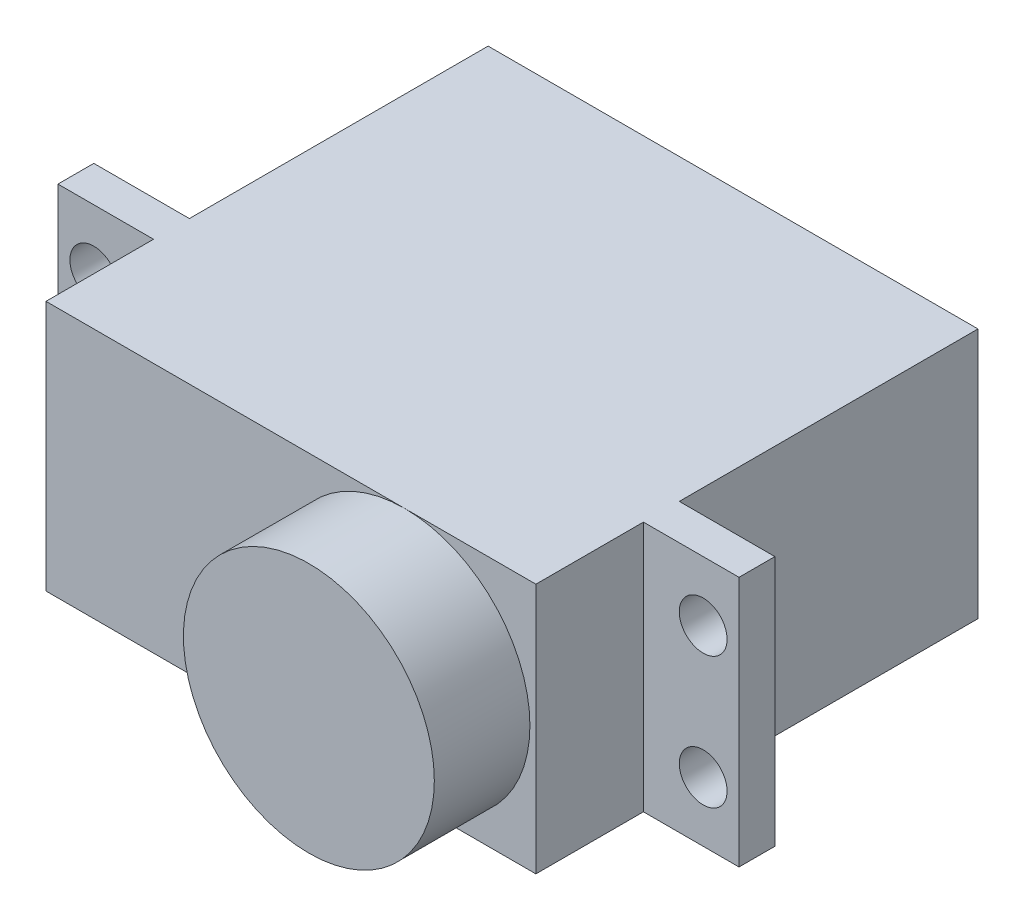
ISO-10303-21;
HEADER;
FILE_DESCRIPTION(('STEP AP214'),'2;1');
FILE_NAME('part.step','',(''),(''),'','','');
FILE_SCHEMA(('AUTOMOTIVE_DESIGN { 1 0 10303 214 1 1 1 1 }'));
ENDSEC;
DATA;
#1=APPLICATION_CONTEXT('core data for automotive mechanical design processes');
#2=APPLICATION_PROTOCOL_DEFINITION('international standard','automotive_design',2000,#1);
#3=PRODUCT_CONTEXT('',#1,'mechanical');
#4=PRODUCT('Part','Part','',(#3));
#5=PRODUCT_RELATED_PRODUCT_CATEGORY('part','',(#4));
#6=PRODUCT_DEFINITION_FORMATION('','',#4);
#7=PRODUCT_DEFINITION_CONTEXT('part definition',#1,'design');
#8=PRODUCT_DEFINITION('design','',#6,#7);
#9=PRODUCT_DEFINITION_SHAPE('','',#8);
#10=(LENGTH_UNIT() NAMED_UNIT(*) SI_UNIT(.MILLI.,.METRE.));
#11=(NAMED_UNIT(*) PLANE_ANGLE_UNIT() SI_UNIT($,.RADIAN.));
#12=(NAMED_UNIT(*) SI_UNIT($,.STERADIAN.) SOLID_ANGLE_UNIT());
#13=UNCERTAINTY_MEASURE_WITH_UNIT(LENGTH_MEASURE(1.E-05),#10,'distance_accuracy_value','');
#14=(GEOMETRIC_REPRESENTATION_CONTEXT(3) GLOBAL_UNCERTAINTY_ASSIGNED_CONTEXT((#13)) GLOBAL_UNIT_ASSIGNED_CONTEXT((#10,
#11,#12)) REPRESENTATION_CONTEXT('',''));
#15=CARTESIAN_POINT('',(0.,0.,0.));
#16=DIRECTION('',(0.,0.,1.));
#17=DIRECTION('',(1.,0.,0.));
#18=AXIS2_PLACEMENT_3D('',#15,#16,#17);
#19=CARTESIAN_POINT('',(0.,0.,37.));
#20=DIRECTION('',(0.,0.,1.));
#21=DIRECTION('',(1.,0.,0.));
#22=AXIS2_PLACEMENT_3D('',#19,#20,#21);
#23=PLANE('',#22);
#24=CARTESIAN_POINT('',(-15.6018212106381,-5.24348589414887,37.));
#25=DIRECTION('',(0.,0.,1.));
#26=DIRECTION('',(1.,0.,0.));
#27=AXIS2_PLACEMENT_3D('',#24,#25,#26);
#28=CIRCLE('',#27,10.5);
#29=CARTESIAN_POINT('',(-15.6018212106381,5.25651410585113,37.));
#30=VERTEX_POINT('',#29);
#31=CARTESIAN_POINT('',(-15.6018212106381,-15.7434858941489,37.));
#32=VERTEX_POINT('',#31);
#33=EDGE_CURVE('E44',#30,#32,#28,.T.);
#34=ORIENTED_EDGE('',*,*,#33,.F.);
#35=DIRECTION('',(-1.,0.,0.));
#36=VECTOR('',#35,1.);
#37=CARTESIAN_POINT('',(-45.6018212106381,5.25651410585114,37.));
#38=LINE('',#37,#36);
#39=CARTESIAN_POINT('',(-45.6018212106381,5.25651410585114,37.));
#40=VERTEX_POINT('',#39);
#41=EDGE_CURVE('E136',#30,#40,#38,.T.);
#42=ORIENTED_EDGE('',*,*,#41,.T.);
#43=DIRECTION('',(0.,-1.,0.));
#44=VECTOR('',#43,1.);
#45=CARTESIAN_POINT('',(-45.6018212106381,5.25651410585114,37.));
#46=LINE('',#45,#44);
#47=CARTESIAN_POINT('',(-45.6018212106381,-15.7434858941489,37.));
#48=VERTEX_POINT('',#47);
#49=EDGE_CURVE('E361',#40,#48,#46,.T.);
#50=ORIENTED_EDGE('',*,*,#49,.T.);
#51=DIRECTION('',(1.,0.,0.));
#52=VECTOR('',#51,1.);
#53=CARTESIAN_POINT('',(-45.6018212106381,-15.7434858941489,37.));
#54=LINE('',#53,#52);
#55=EDGE_CURVE('E148',#48,#32,#54,.T.);
#56=ORIENTED_EDGE('',*,*,#55,.T.);
#57=EDGE_LOOP('',(#34,#42,#50,#56));
#58=FACE_BOUND('',#57,.T.);
#59=ADVANCED_FACE('F33',(#58),#23,.T.);
#60=CARTESIAN_POINT('',(0.,0.,28.));
#61=DIRECTION('',(0.,0.,-1.));
#62=DIRECTION('',(-1.,0.,0.));
#63=AXIS2_PLACEMENT_3D('',#60,#61,#62);
#64=PLANE('',#63);
#65=CARTESIAN_POINT('',(-50.6018212106381,0.256514105851133,28.));
#66=DIRECTION('',(0.,0.,1.));
#67=DIRECTION('',(1.,0.,0.));
#68=AXIS2_PLACEMENT_3D('',#65,#66,#67);
#69=CIRCLE('',#68,2.);
#70=CARTESIAN_POINT('',(-48.6018212106381,0.256514105851133,28.));
#71=VERTEX_POINT('',#70);
#72=EDGE_CURVE('E367',#71,#71,#69,.T.);
#73=ORIENTED_EDGE('',*,*,#72,.F.);
#74=EDGE_LOOP('',(#73));
#75=FACE_BOUND('',#74,.T.);
#76=CARTESIAN_POINT('',(-50.6018212106381,-10.7434858941489,28.));
#77=DIRECTION('',(0.,0.,1.));
#78=DIRECTION('',(1.,0.,0.));
#79=AXIS2_PLACEMENT_3D('',#76,#77,#78);
#80=CIRCLE('',#79,2.);
#81=CARTESIAN_POINT('',(-48.6018212106381,-10.7434858941489,28.));
#82=VERTEX_POINT('',#81);
#83=EDGE_CURVE('E363',#82,#82,#80,.T.);
#84=ORIENTED_EDGE('',*,*,#83,.F.);
#85=EDGE_LOOP('',(#84));
#86=FACE_BOUND('',#85,.T.);
#87=DIRECTION('',(0.,-1.,0.));
#88=VECTOR('',#87,1.);
#89=CARTESIAN_POINT('',(-45.6018212106381,5.25651410585114,28.));
#90=LINE('',#89,#88);
#91=CARTESIAN_POINT('',(-45.6018212106381,5.25651410585113,28.));
#92=VERTEX_POINT('',#91);
#93=CARTESIAN_POINT('',(-45.6018212106381,-15.7434858941489,28.));
#94=VERTEX_POINT('',#93);
#95=EDGE_CURVE('E352',#92,#94,#90,.T.);
#96=ORIENTED_EDGE('',*,*,#95,.F.);
#97=DIRECTION('',(-1.,0.,0.));
#98=VECTOR('',#97,1.);
#99=CARTESIAN_POINT('',(-4.6018212106381,5.25651410585113,28.));
#100=LINE('',#99,#98);
#101=CARTESIAN_POINT('',(-53.6018212106381,5.25651410585113,28.));
#102=VERTEX_POINT('',#101);
#103=EDGE_CURVE('E296',#92,#102,#100,.T.);
#104=ORIENTED_EDGE('',*,*,#103,.T.);
#105=DIRECTION('',(0.,-1.,0.));
#106=VECTOR('',#105,1.);
#107=CARTESIAN_POINT('',(-53.6018212106381,5.25651410585113,28.));
#108=LINE('',#107,#106);
#109=CARTESIAN_POINT('',(-53.6018212106381,-15.7434858941489,28.));
#110=VERTEX_POINT('',#109);
#111=EDGE_CURVE('E313',#102,#110,#108,.T.);
#112=ORIENTED_EDGE('',*,*,#111,.T.);
#113=DIRECTION('',(1.,0.,0.));
#114=VECTOR('',#113,1.);
#115=CARTESIAN_POINT('',(-45.6018212106381,-15.7434858941489,28.));
#116=LINE('',#115,#114);
#117=EDGE_CURVE('E307',#110,#94,#116,.T.);
#118=ORIENTED_EDGE('',*,*,#117,.T.);
#119=EDGE_LOOP('',(#96,#104,#112,#118));
#120=FACE_BOUND('',#119,.T.);
#121=ADVANCED_FACE('F168',(#75,#86,#120),#64,.F.);
#122=CARTESIAN_POINT('',(0.398178789361906,0.256514105851133,28.));
#123=DIRECTION('',(0.,0.,1.));
#124=DIRECTION('',(1.,0.,0.));
#125=AXIS2_PLACEMENT_3D('',#122,#123,#124);
#126=CIRCLE('',#125,2.);
#127=CARTESIAN_POINT('',(2.39817878936191,0.256514105851133,28.));
#128=VERTEX_POINT('',#127);
#129=EDGE_CURVE('E374',#128,#128,#126,.T.);
#130=ORIENTED_EDGE('',*,*,#129,.F.);
#131=EDGE_LOOP('',(#130));
#132=FACE_BOUND('',#131,.T.);
#133=CARTESIAN_POINT('',(0.398178789361906,-10.7434858941488,28.));
#134=DIRECTION('',(0.,0.,1.));
#135=DIRECTION('',(1.,0.,0.));
#136=AXIS2_PLACEMENT_3D('',#133,#134,#135);
#137=CIRCLE('',#136,2.);
#138=CARTESIAN_POINT('',(2.39817878936191,-10.7434858941488,28.));
#139=VERTEX_POINT('',#138);
#140=EDGE_CURVE('E371',#139,#139,#137,.T.);
#141=ORIENTED_EDGE('',*,*,#140,.F.);
#142=EDGE_LOOP('',(#141));
#143=FACE_BOUND('',#142,.T.);
#144=DIRECTION('',(0.,1.,0.));
#145=VECTOR('',#144,1.);
#146=CARTESIAN_POINT('',(-4.6018212106381,-15.7434858941489,28.));
#147=LINE('',#146,#145);
#148=CARTESIAN_POINT('',(-4.6018212106381,-15.7434858941489,28.));
#149=VERTEX_POINT('',#148);
#150=CARTESIAN_POINT('',(-4.6018212106381,5.25651410585113,28.));
#151=VERTEX_POINT('',#150);
#152=EDGE_CURVE('E57',#149,#151,#147,.T.);
#153=ORIENTED_EDGE('',*,*,#152,.F.);
#154=CARTESIAN_POINT('',(3.39817878936191,-15.7434858941489,28.));
#155=VERTEX_POINT('',#154);
#156=EDGE_CURVE('E308',#149,#155,#116,.T.);
#157=ORIENTED_EDGE('',*,*,#156,.T.);
#158=DIRECTION('',(0.,1.,0.));
#159=VECTOR('',#158,1.);
#160=CARTESIAN_POINT('',(3.3981787893619,5.25651410585113,28.));
#161=LINE('',#160,#159);
#162=CARTESIAN_POINT('',(3.3981787893619,5.25651410585113,28.));
#163=VERTEX_POINT('',#162);
#164=EDGE_CURVE('E284',#155,#163,#161,.T.);
#165=ORIENTED_EDGE('',*,*,#164,.T.);
#166=EDGE_CURVE('E306',#163,#151,#100,.T.);
#167=ORIENTED_EDGE('',*,*,#166,.T.);
#168=EDGE_LOOP('',(#153,#157,#165,#167));
#169=FACE_BOUND('',#168,.T.);
#170=ADVANCED_FACE('F175',(#132,#143,#169),#64,.F.);
#171=CARTESIAN_POINT('',(-45.6018212106381,5.25651410585113,25.));
#172=DIRECTION('',(1.,0.,0.));
#173=DIRECTION('',(0.,1.,0.));
#174=AXIS2_PLACEMENT_3D('',#171,#172,#173);
#175=PLANE('',#174);
#176=DIRECTION('',(0.,-1.,0.));
#177=VECTOR('',#176,1.);
#178=CARTESIAN_POINT('',(-45.6018212106381,5.25651410585113,0.));
#179=LINE('',#178,#177);
#180=CARTESIAN_POINT('',(-45.6018212106381,5.25651410585113,0.));
#181=VERTEX_POINT('',#180);
#182=CARTESIAN_POINT('',(-45.6018212106381,-15.7434858941489,0.));
#183=VERTEX_POINT('',#182);
#184=EDGE_CURVE('E235',#181,#183,#179,.T.);
#185=ORIENTED_EDGE('',*,*,#184,.T.);
#186=DIRECTION('',(0.,0.,-1.));
#187=VECTOR('',#186,1.);
#188=CARTESIAN_POINT('',(-45.6018212106381,-15.7434858941489,25.));
#189=LINE('',#188,#187);
#190=CARTESIAN_POINT('',(-45.6018212106381,-15.7434858941489,25.));
#191=VERTEX_POINT('',#190);
#192=EDGE_CURVE('E42',#191,#183,#189,.T.);
#193=ORIENTED_EDGE('',*,*,#192,.F.);
#194=DIRECTION('',(0.,-1.,0.));
#195=VECTOR('',#194,1.);
#196=CARTESIAN_POINT('',(-45.6018212106381,5.25651410585113,25.));
#197=LINE('',#196,#195);
#198=CARTESIAN_POINT('',(-45.6018212106381,5.25651410585113,25.));
#199=VERTEX_POINT('',#198);
#200=EDGE_CURVE('E246',#199,#191,#197,.T.);
#201=ORIENTED_EDGE('',*,*,#200,.F.);
#202=DIRECTION('',(0.,0.,-1.));
#203=VECTOR('',#202,1.);
#204=CARTESIAN_POINT('',(-45.6018212106381,5.25651410585113,25.));
#205=LINE('',#204,#203);
#206=EDGE_CURVE('E251',#199,#181,#205,.T.);
#207=ORIENTED_EDGE('',*,*,#206,.T.);
#208=EDGE_LOOP('',(#185,#193,#201,#207));
#209=FACE_BOUND('',#208,.T.);
#210=ADVANCED_FACE('F35',(#209),#175,.F.);
#211=CARTESIAN_POINT('',(-45.6018212106381,-15.7434858941489,25.));
#212=DIRECTION('',(0.,1.,0.));
#213=DIRECTION('',(0.,0.,1.));
#214=AXIS2_PLACEMENT_3D('',#211,#212,#213);
#215=PLANE('',#214);
#216=DIRECTION('',(1.,0.,0.));
#217=VECTOR('',#216,1.);
#218=CARTESIAN_POINT('',(-45.6018212106381,-15.7434858941489,0.));
#219=LINE('',#218,#217);
#220=CARTESIAN_POINT('',(-4.60182121063809,-15.7434858941489,0.));
#221=VERTEX_POINT('',#220);
#222=EDGE_CURVE('E226',#183,#221,#219,.T.);
#223=ORIENTED_EDGE('',*,*,#222,.T.);
#224=DIRECTION('',(0.,0.,-1.));
#225=VECTOR('',#224,1.);
#226=CARTESIAN_POINT('',(-4.60182121063809,-15.7434858941489,25.));
#227=LINE('',#226,#225);
#228=CARTESIAN_POINT('',(-4.60182121063809,-15.7434858941489,25.));
#229=VERTEX_POINT('',#228);
#230=EDGE_CURVE('E228',#229,#221,#227,.T.);
#231=ORIENTED_EDGE('',*,*,#230,.F.);
#232=DIRECTION('',(1.,0.,0.));
#233=VECTOR('',#232,1.);
#234=CARTESIAN_POINT('',(-4.60182121063809,-15.7434858941489,25.));
#235=LINE('',#234,#233);
#236=CARTESIAN_POINT('',(3.39817878936191,-15.7434858941489,25.));
#237=VERTEX_POINT('',#236);
#238=EDGE_CURVE('E288',#229,#237,#235,.T.);
#239=ORIENTED_EDGE('',*,*,#238,.T.);
#240=DIRECTION('',(0.,0.,-1.));
#241=VECTOR('',#240,1.);
#242=CARTESIAN_POINT('',(3.39817878936191,-15.7434858941489,28.));
#243=LINE('',#242,#241);
#244=EDGE_CURVE('E270',#155,#237,#243,.T.);
#245=ORIENTED_EDGE('',*,*,#244,.F.);
#246=ORIENTED_EDGE('',*,*,#156,.F.);
#247=DIRECTION('',(0.,0.,-1.));
#248=VECTOR('',#247,1.);
#249=CARTESIAN_POINT('',(-4.6018212106381,-15.7434858941489,37.));
#250=LINE('',#249,#248);
#251=CARTESIAN_POINT('',(-4.6018212106381,-15.7434858941489,37.));
#252=VERTEX_POINT('',#251);
#253=EDGE_CURVE('E340',#252,#149,#250,.T.);
#254=ORIENTED_EDGE('',*,*,#253,.F.);
#255=EDGE_CURVE('E360',#32,#252,#54,.T.);
#256=ORIENTED_EDGE('',*,*,#255,.F.);
#257=ORIENTED_EDGE('',*,*,#55,.F.);
#258=DIRECTION('',(0.,0.,-1.));
#259=VECTOR('',#258,1.);
#260=CARTESIAN_POINT('',(-45.6018212106381,-15.7434858941489,37.));
#261=LINE('',#260,#259);
#262=EDGE_CURVE('E339',#48,#94,#261,.T.);
#263=ORIENTED_EDGE('',*,*,#262,.T.);
#264=ORIENTED_EDGE('',*,*,#117,.F.);
#265=DIRECTION('',(0.,0.,-1.));
#266=VECTOR('',#265,1.);
#267=CARTESIAN_POINT('',(-53.6018212106381,-15.7434858941489,28.));
#268=LINE('',#267,#266);
#269=CARTESIAN_POINT('',(-53.6018212106381,-15.7434858941489,25.));
#270=VERTEX_POINT('',#269);
#271=EDGE_CURVE('E263',#110,#270,#268,.T.);
#272=ORIENTED_EDGE('',*,*,#271,.T.);
#273=EDGE_CURVE('E294',#270,#191,#235,.T.);
#274=ORIENTED_EDGE('',*,*,#273,.T.);
#275=ORIENTED_EDGE('',*,*,#192,.T.);
#276=EDGE_LOOP('',(#223,#231,#239,#245,#246,#254,#256,#257,#263,#264,#272,#274,#275));
#277=FACE_BOUND('',#276,.T.);
#278=ADVANCED_FACE('F218',(#277),#215,.F.);
#279=CARTESIAN_POINT('',(-4.6018212106381,5.25651410585113,25.));
#280=DIRECTION('',(-1.,0.,0.));
#281=DIRECTION('',(0.,-1.,0.));
#282=AXIS2_PLACEMENT_3D('',#279,#280,#281);
#283=PLANE('',#282);
#284=DIRECTION('',(0.,1.,0.));
#285=VECTOR('',#284,1.);
#286=CARTESIAN_POINT('',(-4.6018212106381,5.25651410585113,0.));
#287=LINE('',#286,#285);
#288=CARTESIAN_POINT('',(-4.6018212106381,5.25651410585113,0.));
#289=VERTEX_POINT('',#288);
#290=EDGE_CURVE('E234',#221,#289,#287,.T.);
#291=ORIENTED_EDGE('',*,*,#290,.T.);
#292=DIRECTION('',(0.,0.,-1.));
#293=VECTOR('',#292,1.);
#294=CARTESIAN_POINT('',(-4.6018212106381,5.25651410585113,25.));
#295=LINE('',#294,#293);
#296=CARTESIAN_POINT('',(-4.6018212106381,5.25651410585114,25.));
#297=VERTEX_POINT('',#296);
#298=EDGE_CURVE('E241',#297,#289,#295,.T.);
#299=ORIENTED_EDGE('',*,*,#298,.F.);
#300=DIRECTION('',(0.,1.,0.));
#301=VECTOR('',#300,1.);
#302=CARTESIAN_POINT('',(-4.6018212106381,5.25651410585113,25.));
#303=LINE('',#302,#301);
#304=EDGE_CURVE('E239',#229,#297,#303,.T.);
#305=ORIENTED_EDGE('',*,*,#304,.F.);
#306=ORIENTED_EDGE('',*,*,#230,.T.);
#307=EDGE_LOOP('',(#291,#299,#305,#306));
#308=FACE_BOUND('',#307,.T.);
#309=ADVANCED_FACE('F216',(#308),#283,.F.);
#310=CARTESIAN_POINT('',(-45.6018212106381,5.25651410585113,25.));
#311=DIRECTION('',(0.,-1.,0.));
#312=DIRECTION('',(0.,0.,-1.));
#313=AXIS2_PLACEMENT_3D('',#310,#311,#312);
#314=PLANE('',#313);
#315=DIRECTION('',(-1.,0.,0.));
#316=VECTOR('',#315,1.);
#317=CARTESIAN_POINT('',(-45.6018212106381,5.25651410585113,0.));
#318=LINE('',#317,#316);
#319=EDGE_CURVE('E244',#289,#181,#318,.T.);
#320=ORIENTED_EDGE('',*,*,#319,.T.);
#321=ORIENTED_EDGE('',*,*,#206,.F.);
#322=DIRECTION('',(-1.,0.,0.));
#323=VECTOR('',#322,1.);
#324=CARTESIAN_POINT('',(-45.6018212106381,5.25651410585113,25.));
#325=LINE('',#324,#323);
#326=CARTESIAN_POINT('',(-53.6018212106381,5.25651410585113,25.));
#327=VERTEX_POINT('',#326);
#328=EDGE_CURVE('E279',#199,#327,#325,.T.);
#329=ORIENTED_EDGE('',*,*,#328,.T.);
#330=DIRECTION('',(0.,0.,-1.));
#331=VECTOR('',#330,1.);
#332=CARTESIAN_POINT('',(-53.6018212106381,5.25651410585113,28.));
#333=LINE('',#332,#331);
#334=EDGE_CURVE('E260',#102,#327,#333,.T.);
#335=ORIENTED_EDGE('',*,*,#334,.F.);
#336=ORIENTED_EDGE('',*,*,#103,.F.);
#337=DIRECTION('',(0.,0.,-1.));
#338=VECTOR('',#337,1.);
#339=CARTESIAN_POINT('',(-45.6018212106381,5.25651410585114,37.));
#340=LINE('',#339,#338);
#341=EDGE_CURVE('E135',#40,#92,#340,.T.);
#342=ORIENTED_EDGE('',*,*,#341,.F.);
#343=ORIENTED_EDGE('',*,*,#41,.F.);
#344=CARTESIAN_POINT('',(-4.6018212106381,5.25651410585113,37.));
#345=VERTEX_POINT('',#344);
#346=EDGE_CURVE('E127',#345,#30,#38,.T.);
#347=ORIENTED_EDGE('',*,*,#346,.F.);
#348=DIRECTION('',(0.,0.,-1.));
#349=VECTOR('',#348,1.);
#350=CARTESIAN_POINT('',(-4.6018212106381,5.25651410585113,37.));
#351=LINE('',#350,#349);
#352=EDGE_CURVE('E345',#345,#151,#351,.T.);
#353=ORIENTED_EDGE('',*,*,#352,.T.);
#354=ORIENTED_EDGE('',*,*,#166,.F.);
#355=DIRECTION('',(0.,0.,-1.));
#356=VECTOR('',#355,1.);
#357=CARTESIAN_POINT('',(3.3981787893619,5.25651410585113,28.));
#358=LINE('',#357,#356);
#359=CARTESIAN_POINT('',(3.3981787893619,5.25651410585113,25.));
#360=VERTEX_POINT('',#359);
#361=EDGE_CURVE('E304',#163,#360,#358,.T.);
#362=ORIENTED_EDGE('',*,*,#361,.T.);
#363=EDGE_CURVE('E274',#360,#297,#325,.T.);
#364=ORIENTED_EDGE('',*,*,#363,.T.);
#365=ORIENTED_EDGE('',*,*,#298,.T.);
#366=EDGE_LOOP('',(#320,#321,#329,#335,#336,#342,#343,#347,#353,#354,#362,#364,#365));
#367=FACE_BOUND('',#366,.T.);
#368=ADVANCED_FACE('F140',(#367),#314,.F.);
#369=CARTESIAN_POINT('',(0.,0.,0.));
#370=DIRECTION('',(0.,0.,1.));
#371=DIRECTION('',(1.,0.,0.));
#372=AXIS2_PLACEMENT_3D('',#369,#370,#371);
#373=PLANE('',#372);
#374=ORIENTED_EDGE('',*,*,#184,.F.);
#375=ORIENTED_EDGE('',*,*,#319,.F.);
#376=ORIENTED_EDGE('',*,*,#290,.F.);
#377=ORIENTED_EDGE('',*,*,#222,.F.);
#378=EDGE_LOOP('',(#374,#375,#376,#377));
#379=FACE_BOUND('',#378,.T.);
#380=ADVANCED_FACE('F211',(#379),#373,.F.);
#381=CARTESIAN_POINT('',(0.,0.,25.));
#382=DIRECTION('',(0.,0.,-1.));
#383=DIRECTION('',(-1.,0.,0.));
#384=AXIS2_PLACEMENT_3D('',#381,#382,#383);
#385=PLANE('',#384);
#386=CARTESIAN_POINT('',(-50.6018212106381,0.256514105851133,25.));
#387=DIRECTION('',(0.,0.,-1.));
#388=DIRECTION('',(-1.,0.,0.));
#389=AXIS2_PLACEMENT_3D('',#386,#387,#388);
#390=CIRCLE('',#389,2.);
#391=CARTESIAN_POINT('',(-52.6018212106381,0.256514105851133,25.));
#392=VERTEX_POINT('',#391);
#393=EDGE_CURVE('E366',#392,#392,#390,.T.);
#394=ORIENTED_EDGE('',*,*,#393,.F.);
#395=EDGE_LOOP('',(#394));
#396=FACE_BOUND('',#395,.T.);
#397=CARTESIAN_POINT('',(-50.6018212106381,-10.7434858941489,25.));
#398=DIRECTION('',(0.,0.,-1.));
#399=DIRECTION('',(-1.,0.,0.));
#400=AXIS2_PLACEMENT_3D('',#397,#398,#399);
#401=CIRCLE('',#400,2.);
#402=CARTESIAN_POINT('',(-52.6018212106381,-10.7434858941489,25.));
#403=VERTEX_POINT('',#402);
#404=EDGE_CURVE('E354',#403,#403,#401,.T.);
#405=ORIENTED_EDGE('',*,*,#404,.F.);
#406=EDGE_LOOP('',(#405));
#407=FACE_BOUND('',#406,.T.);
#408=ORIENTED_EDGE('',*,*,#328,.F.);
#409=ORIENTED_EDGE('',*,*,#200,.T.);
#410=ORIENTED_EDGE('',*,*,#273,.F.);
#411=DIRECTION('',(0.,-1.,0.));
#412=VECTOR('',#411,1.);
#413=CARTESIAN_POINT('',(-53.6018212106381,5.25651410585113,25.));
#414=LINE('',#413,#412);
#415=EDGE_CURVE('E278',#327,#270,#414,.T.);
#416=ORIENTED_EDGE('',*,*,#415,.F.);
#417=EDGE_LOOP('',(#408,#409,#410,#416));
#418=FACE_BOUND('',#417,.T.);
#419=ADVANCED_FACE('F203',(#396,#407,#418),#385,.T.);
#420=CARTESIAN_POINT('',(-53.6018212106381,5.25651410585113,28.));
#421=DIRECTION('',(1.,0.,0.));
#422=DIRECTION('',(0.,0.,-1.));
#423=AXIS2_PLACEMENT_3D('',#420,#421,#422);
#424=PLANE('',#423);
#425=ORIENTED_EDGE('',*,*,#415,.T.);
#426=ORIENTED_EDGE('',*,*,#271,.F.);
#427=ORIENTED_EDGE('',*,*,#111,.F.);
#428=ORIENTED_EDGE('',*,*,#334,.T.);
#429=EDGE_LOOP('',(#425,#426,#427,#428));
#430=FACE_BOUND('',#429,.T.);
#431=ADVANCED_FACE('F206',(#430),#424,.F.);
#432=CARTESIAN_POINT('',(3.3981787893619,5.25651410585113,28.));
#433=DIRECTION('',(-1.,0.,0.));
#434=DIRECTION('',(0.,-1.,0.));
#435=AXIS2_PLACEMENT_3D('',#432,#433,#434);
#436=PLANE('',#435);
#437=DIRECTION('',(0.,1.,0.));
#438=VECTOR('',#437,1.);
#439=CARTESIAN_POINT('',(3.3981787893619,5.25651410585113,25.));
#440=LINE('',#439,#438);
#441=EDGE_CURVE('E291',#237,#360,#440,.T.);
#442=ORIENTED_EDGE('',*,*,#441,.T.);
#443=ORIENTED_EDGE('',*,*,#361,.F.);
#444=ORIENTED_EDGE('',*,*,#164,.F.);
#445=ORIENTED_EDGE('',*,*,#244,.T.);
#446=EDGE_LOOP('',(#442,#443,#444,#445));
#447=FACE_BOUND('',#446,.T.);
#448=ADVANCED_FACE('F201',(#447),#436,.F.);
#449=CARTESIAN_POINT('',(0.398178789361906,0.256514105851133,25.));
#450=DIRECTION('',(0.,0.,-1.));
#451=DIRECTION('',(-1.,0.,0.));
#452=AXIS2_PLACEMENT_3D('',#449,#450,#451);
#453=CIRCLE('',#452,2.);
#454=CARTESIAN_POINT('',(-1.60182121063809,0.256514105851133,25.));
#455=VERTEX_POINT('',#454);
#456=EDGE_CURVE('E37',#455,#455,#453,.T.);
#457=ORIENTED_EDGE('',*,*,#456,.F.);
#458=EDGE_LOOP('',(#457));
#459=FACE_BOUND('',#458,.T.);
#460=CARTESIAN_POINT('',(0.398178789361906,-10.7434858941488,25.));
#461=DIRECTION('',(0.,0.,-1.));
#462=DIRECTION('',(-1.,0.,0.));
#463=AXIS2_PLACEMENT_3D('',#460,#461,#462);
#464=CIRCLE('',#463,2.);
#465=CARTESIAN_POINT('',(-1.60182121063809,-10.7434858941488,25.));
#466=VERTEX_POINT('',#465);
#467=EDGE_CURVE('E370',#466,#466,#464,.T.);
#468=ORIENTED_EDGE('',*,*,#467,.F.);
#469=EDGE_LOOP('',(#468));
#470=FACE_BOUND('',#469,.T.);
#471=ORIENTED_EDGE('',*,*,#238,.F.);
#472=ORIENTED_EDGE('',*,*,#304,.T.);
#473=ORIENTED_EDGE('',*,*,#363,.F.);
#474=ORIENTED_EDGE('',*,*,#441,.F.);
#475=EDGE_LOOP('',(#471,#472,#473,#474));
#476=FACE_BOUND('',#475,.T.);
#477=ADVANCED_FACE('F195',(#459,#470,#476),#385,.T.);
#478=CARTESIAN_POINT('',(-45.6018212106381,5.25651410585114,37.));
#479=DIRECTION('',(1.,0.,0.));
#480=DIRECTION('',(0.,0.,-1.));
#481=AXIS2_PLACEMENT_3D('',#478,#479,#480);
#482=PLANE('',#481);
#483=ORIENTED_EDGE('',*,*,#95,.T.);
#484=ORIENTED_EDGE('',*,*,#262,.F.);
#485=ORIENTED_EDGE('',*,*,#49,.F.);
#486=ORIENTED_EDGE('',*,*,#341,.T.);
#487=EDGE_LOOP('',(#483,#484,#485,#486));
#488=FACE_BOUND('',#487,.T.);
#489=ADVANCED_FACE('F190',(#488),#482,.F.);
#490=CARTESIAN_POINT('',(-4.6018212106381,-15.7434858941489,37.));
#491=DIRECTION('',(-1.,0.,0.));
#492=DIRECTION('',(0.,0.,1.));
#493=AXIS2_PLACEMENT_3D('',#490,#491,#492);
#494=PLANE('',#493);
#495=ORIENTED_EDGE('',*,*,#152,.T.);
#496=ORIENTED_EDGE('',*,*,#352,.F.);
#497=DIRECTION('',(0.,1.,0.));
#498=VECTOR('',#497,1.);
#499=CARTESIAN_POINT('',(-4.6018212106381,-15.7434858941489,37.));
#500=LINE('',#499,#498);
#501=EDGE_CURVE('E131',#252,#345,#500,.T.);
#502=ORIENTED_EDGE('',*,*,#501,.F.);
#503=ORIENTED_EDGE('',*,*,#253,.T.);
#504=EDGE_LOOP('',(#495,#496,#502,#503));
#505=FACE_BOUND('',#504,.T.);
#506=ADVANCED_FACE('F182',(#505),#494,.F.);
#507=EDGE_CURVE('E11',#32,#30,#28,.T.);
#508=ORIENTED_EDGE('',*,*,#507,.F.);
#509=ORIENTED_EDGE('',*,*,#255,.T.);
#510=ORIENTED_EDGE('',*,*,#501,.T.);
#511=ORIENTED_EDGE('',*,*,#346,.T.);
#512=EDGE_LOOP('',(#508,#509,#510,#511));
#513=FACE_BOUND('',#512,.T.);
#514=ADVANCED_FACE('F129',(#513),#23,.T.);
#515=CARTESIAN_POINT('',(-50.6018212106381,-10.7434858941489,19.));
#516=DIRECTION('',(0.,0.,1.));
#517=DIRECTION('',(1.,0.,0.));
#518=AXIS2_PLACEMENT_3D('',#515,#516,#517);
#519=CYLINDRICAL_SURFACE('',#518,2.);
#520=ORIENTED_EDGE('',*,*,#404,.T.);
#521=EDGE_LOOP('',(#520));
#522=FACE_BOUND('',#521,.T.);
#523=ORIENTED_EDGE('',*,*,#83,.T.);
#524=EDGE_LOOP('',(#523));
#525=FACE_BOUND('',#524,.T.);
#526=ADVANCED_FACE('F181',(#522,#525),#519,.F.);
#527=CARTESIAN_POINT('',(-50.6018212106381,0.256514105851133,19.));
#528=DIRECTION('',(0.,0.,1.));
#529=DIRECTION('',(1.,0.,0.));
#530=AXIS2_PLACEMENT_3D('',#527,#528,#529);
#531=CYLINDRICAL_SURFACE('',#530,2.);
#532=ORIENTED_EDGE('',*,*,#393,.T.);
#533=EDGE_LOOP('',(#532));
#534=FACE_BOUND('',#533,.T.);
#535=ORIENTED_EDGE('',*,*,#72,.T.);
#536=EDGE_LOOP('',(#535));
#537=FACE_BOUND('',#536,.T.);
#538=ADVANCED_FACE('F187',(#534,#537),#531,.F.);
#539=CARTESIAN_POINT('',(0.398178789361906,-10.7434858941488,19.));
#540=DIRECTION('',(0.,0.,1.));
#541=DIRECTION('',(1.,0.,0.));
#542=AXIS2_PLACEMENT_3D('',#539,#540,#541);
#543=CYLINDRICAL_SURFACE('',#542,2.);
#544=ORIENTED_EDGE('',*,*,#467,.T.);
#545=EDGE_LOOP('',(#544));
#546=FACE_BOUND('',#545,.T.);
#547=ORIENTED_EDGE('',*,*,#140,.T.);
#548=EDGE_LOOP('',(#547));
#549=FACE_BOUND('',#548,.T.);
#550=ADVANCED_FACE('F163',(#546,#549),#543,.F.);
#551=CARTESIAN_POINT('',(0.398178789361906,0.256514105851133,19.));
#552=DIRECTION('',(0.,0.,1.));
#553=DIRECTION('',(1.,0.,0.));
#554=AXIS2_PLACEMENT_3D('',#551,#552,#553);
#555=CYLINDRICAL_SURFACE('',#554,2.);
#556=ORIENTED_EDGE('',*,*,#456,.T.);
#557=EDGE_LOOP('',(#556));
#558=FACE_BOUND('',#557,.T.);
#559=ORIENTED_EDGE('',*,*,#129,.T.);
#560=EDGE_LOOP('',(#559));
#561=FACE_BOUND('',#560,.T.);
#562=ADVANCED_FACE('F154',(#558,#561),#555,.F.);
#563=CARTESIAN_POINT('',(-15.6018212106381,-5.24348589414887,45.));
#564=DIRECTION('',(0.,0.,-1.));
#565=DIRECTION('',(-1.,0.,0.));
#566=AXIS2_PLACEMENT_3D('',#563,#564,#565);
#567=CYLINDRICAL_SURFACE('',#566,10.5);
#568=CARTESIAN_POINT('',(-15.6018212106381,-5.24348589414887,45.));
#569=DIRECTION('',(0.,0.,1.));
#570=DIRECTION('',(1.,0.,0.));
#571=AXIS2_PLACEMENT_3D('',#568,#569,#570);
#572=CIRCLE('',#571,10.5);
#573=CARTESIAN_POINT('',(-5.1018212106381,-5.24348589414887,45.));
#574=VERTEX_POINT('',#573);
#575=EDGE_CURVE('E150',#574,#574,#572,.T.);
#576=ORIENTED_EDGE('',*,*,#575,.F.);
#577=EDGE_LOOP('',(#576));
#578=FACE_BOUND('',#577,.T.);
#579=ORIENTED_EDGE('',*,*,#33,.T.);
#580=ORIENTED_EDGE('',*,*,#507,.T.);
#581=EDGE_LOOP('',(#579,#580));
#582=FACE_BOUND('',#581,.T.);
#583=ADVANCED_FACE('F151',(#578,#582),#567,.T.);
#584=CARTESIAN_POINT('',(-15.6018212106381,-5.24348589414887,45.));
#585=DIRECTION('',(0.,0.,1.));
#586=DIRECTION('',(1.,0.,0.));
#587=AXIS2_PLACEMENT_3D('',#584,#585,#586);
#588=PLANE('',#587);
#589=ORIENTED_EDGE('',*,*,#575,.T.);
#590=EDGE_LOOP('',(#589));
#591=FACE_BOUND('',#590,.T.);
#592=ADVANCED_FACE('F153',(#591),#588,.T.);
#593=CLOSED_SHELL('',(#59,#121,#170,#210,#278,#309,#368,#380,#419,#431,#448,#477,#489,#506,#514,
#526,#538,#550,#562,#583,#592));
#594=MANIFOLD_SOLID_BREP('B2',#593);
#595=ADVANCED_BREP_SHAPE_REPRESENTATION('',(#18,#594),#14);
#596=SHAPE_DEFINITION_REPRESENTATION(#9,#595);
ENDSEC;
END-ISO-10303-21;
